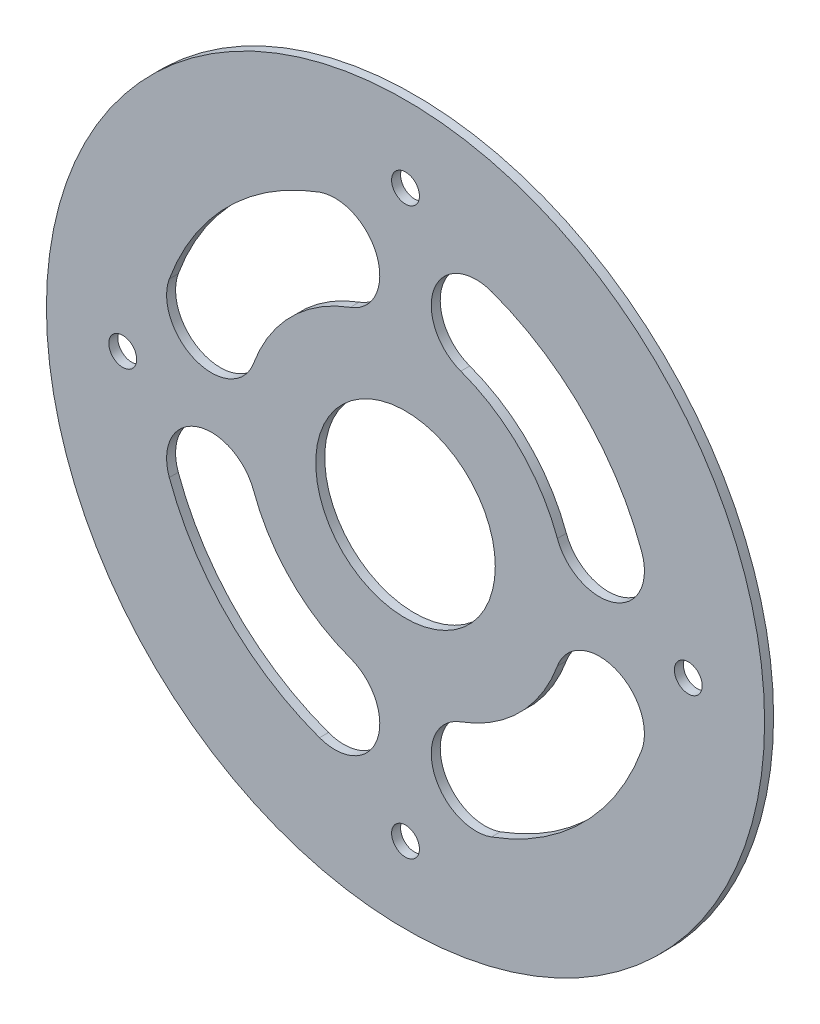
ISO-10303-21;
HEADER;
FILE_DESCRIPTION(('STEP AP214'),'2;1');
FILE_NAME('part.step','',(''),(''),'','','');
FILE_SCHEMA(('AUTOMOTIVE_DESIGN { 1 0 10303 214 1 1 1 1 }'));
ENDSEC;
DATA;
#1=APPLICATION_CONTEXT('core data for automotive mechanical design processes');
#2=APPLICATION_PROTOCOL_DEFINITION('international standard','automotive_design',2000,#1);
#3=PRODUCT_CONTEXT('',#1,'mechanical');
#4=PRODUCT('Part','Part','',(#3));
#5=PRODUCT_RELATED_PRODUCT_CATEGORY('part','',(#4));
#6=PRODUCT_DEFINITION_FORMATION('','',#4);
#7=PRODUCT_DEFINITION_CONTEXT('part definition',#1,'design');
#8=PRODUCT_DEFINITION('design','',#6,#7);
#9=PRODUCT_DEFINITION_SHAPE('','',#8);
#10=(LENGTH_UNIT() NAMED_UNIT(*) SI_UNIT(.MILLI.,.METRE.));
#11=(NAMED_UNIT(*) PLANE_ANGLE_UNIT() SI_UNIT($,.RADIAN.));
#12=(NAMED_UNIT(*) SI_UNIT($,.STERADIAN.) SOLID_ANGLE_UNIT());
#13=UNCERTAINTY_MEASURE_WITH_UNIT(LENGTH_MEASURE(1.E-05),#10,'distance_accuracy_value','');
#14=(GEOMETRIC_REPRESENTATION_CONTEXT(3) GLOBAL_UNCERTAINTY_ASSIGNED_CONTEXT((#13)) GLOBAL_UNIT_ASSIGNED_CONTEXT((#10,
#11,#12)) REPRESENTATION_CONTEXT('',''));
#15=CARTESIAN_POINT('',(0.,0.,0.));
#16=DIRECTION('',(0.,0.,1.));
#17=DIRECTION('',(1.,0.,0.));
#18=AXIS2_PLACEMENT_3D('',#15,#16,#17);
#19=CARTESIAN_POINT('',(0.,0.,1.));
#20=DIRECTION('',(0.,0.,-1.));
#21=DIRECTION('',(-1.,0.,0.));
#22=AXIS2_PLACEMENT_3D('',#19,#20,#21);
#23=CYLINDRICAL_SURFACE('',#22,40.);
#24=CARTESIAN_POINT('',(0.,0.,1.));
#25=DIRECTION('',(0.,0.,1.));
#26=DIRECTION('',(1.,0.,0.));
#27=AXIS2_PLACEMENT_3D('',#24,#25,#26);
#28=CIRCLE('',#27,40.);
#29=CARTESIAN_POINT('',(40.,0.,1.));
#30=VERTEX_POINT('',#29);
#31=EDGE_CURVE('E11',#30,#30,#28,.T.);
#32=ORIENTED_EDGE('',*,*,#31,.F.);
#33=EDGE_LOOP('',(#32));
#34=FACE_BOUND('',#33,.T.);
#35=CARTESIAN_POINT('',(0.,0.,0.));
#36=DIRECTION('',(0.,0.,1.));
#37=DIRECTION('',(1.,0.,0.));
#38=AXIS2_PLACEMENT_3D('',#35,#36,#37);
#39=CIRCLE('',#38,40.);
#40=CARTESIAN_POINT('',(40.,0.,0.));
#41=VERTEX_POINT('',#40);
#42=EDGE_CURVE('E39',#41,#41,#39,.T.);
#43=ORIENTED_EDGE('',*,*,#42,.T.);
#44=EDGE_LOOP('',(#43));
#45=FACE_BOUND('',#44,.T.);
#46=ADVANCED_FACE('F36',(#34,#45),#23,.T.);
#47=CARTESIAN_POINT('',(0.,0.,1.));
#48=DIRECTION('',(0.,0.,1.));
#49=DIRECTION('',(1.,0.,0.));
#50=AXIS2_PLACEMENT_3D('',#47,#48,#49);
#51=PLANE('',#50);
#52=CARTESIAN_POINT('',(21.6129302780759,7.86646329649048,1.));
#53=DIRECTION('',(0.,0.,1.));
#54=DIRECTION('',(0.,1.,0.));
#55=AXIS2_PLACEMENT_3D('',#52,#53,#54);
#56=CIRCLE('',#55,5.);
#57=CARTESIAN_POINT('',(16.9144671741463,6.15636257986211,1.));
#58=VERTEX_POINT('',#57);
#59=CARTESIAN_POINT('',(26.3113933820054,9.57656401311882,1.));
#60=VERTEX_POINT('',#59);
#61=EDGE_CURVE('E50',#58,#60,#56,.T.);
#62=ORIENTED_EDGE('',*,*,#61,.F.);
#63=CARTESIAN_POINT('',(0.,0.,1.));
#64=DIRECTION('',(0.,0.,-1.));
#65=DIRECTION('',(0.,1.,0.));
#66=AXIS2_PLACEMENT_3D('',#63,#64,#65);
#67=CIRCLE('',#66,18.);
#68=CARTESIAN_POINT('',(6.15636257986199,16.9144671741464,1.));
#69=VERTEX_POINT('',#68);
#70=EDGE_CURVE('E169',#69,#58,#67,.T.);
#71=ORIENTED_EDGE('',*,*,#70,.F.);
#72=CARTESIAN_POINT('',(7.86646329649031,21.6129302780759,1.));
#73=DIRECTION('',(0.,0.,1.));
#74=DIRECTION('',(0.,1.,0.));
#75=AXIS2_PLACEMENT_3D('',#72,#73,#74);
#76=CIRCLE('',#75,5.);
#77=CARTESIAN_POINT('',(9.57656401311865,26.3113933820055,1.));
#78=VERTEX_POINT('',#77);
#79=EDGE_CURVE('E172',#78,#69,#76,.T.);
#80=ORIENTED_EDGE('',*,*,#79,.F.);
#81=CARTESIAN_POINT('',(0.,0.,1.));
#82=DIRECTION('',(0.,0.,1.));
#83=DIRECTION('',(0.,1.,0.));
#84=AXIS2_PLACEMENT_3D('',#81,#82,#83);
#85=CIRCLE('',#84,28.);
#86=EDGE_CURVE('E178',#60,#78,#85,.T.);
#87=ORIENTED_EDGE('',*,*,#86,.F.);
#88=EDGE_LOOP('',(#62,#71,#80,#87));
#89=FACE_BOUND('',#88,.T.);
#90=CARTESIAN_POINT('',(-7.8664632964904,21.6129302780759,1.));
#91=DIRECTION('',(0.,0.,1.));
#92=DIRECTION('',(-1.,0.,0.));
#93=AXIS2_PLACEMENT_3D('',#90,#91,#92);
#94=CIRCLE('',#93,5.);
#95=CARTESIAN_POINT('',(-6.15636257986205,16.9144671741463,1.));
#96=VERTEX_POINT('',#95);
#97=CARTESIAN_POINT('',(-9.57656401311873,26.3113933820054,1.));
#98=VERTEX_POINT('',#97);
#99=EDGE_CURVE('E58',#96,#98,#94,.T.);
#100=ORIENTED_EDGE('',*,*,#99,.F.);
#101=CARTESIAN_POINT('',(0.,0.,1.));
#102=DIRECTION('',(0.,0.,-1.));
#103=DIRECTION('',(-1.,0.,0.));
#104=AXIS2_PLACEMENT_3D('',#101,#102,#103);
#105=CIRCLE('',#104,18.);
#106=CARTESIAN_POINT('',(-16.9144671741463,6.15636257986205,1.));
#107=VERTEX_POINT('',#106);
#108=EDGE_CURVE('E193',#107,#96,#105,.T.);
#109=ORIENTED_EDGE('',*,*,#108,.F.);
#110=CARTESIAN_POINT('',(-21.6129302780759,7.86646329649039,1.));
#111=DIRECTION('',(0.,0.,1.));
#112=DIRECTION('',(-1.,0.,0.));
#113=AXIS2_PLACEMENT_3D('',#110,#111,#112);
#114=CIRCLE('',#113,5.);
#115=CARTESIAN_POINT('',(-26.3113933820054,9.57656401311874,1.));
#116=VERTEX_POINT('',#115);
#117=EDGE_CURVE('E208',#116,#107,#114,.T.);
#118=ORIENTED_EDGE('',*,*,#117,.F.);
#119=CARTESIAN_POINT('',(0.,0.,1.));
#120=DIRECTION('',(0.,0.,1.));
#121=DIRECTION('',(-1.,0.,0.));
#122=AXIS2_PLACEMENT_3D('',#119,#120,#121);
#123=CIRCLE('',#122,28.);
#124=EDGE_CURVE('E204',#98,#116,#123,.T.);
#125=ORIENTED_EDGE('',*,*,#124,.F.);
#126=EDGE_LOOP('',(#100,#109,#118,#125));
#127=FACE_BOUND('',#126,.T.);
#128=CARTESIAN_POINT('',(-21.6129302780758,-7.86646329649063,1.));
#129=DIRECTION('',(0.,0.,1.));
#130=DIRECTION('',(0.,-1.,0.));
#131=AXIS2_PLACEMENT_3D('',#128,#129,#130);
#132=CIRCLE('',#131,5.);
#133=CARTESIAN_POINT('',(-16.9144671741463,-6.15636257986223,1.));
#134=VERTEX_POINT('',#133);
#135=CARTESIAN_POINT('',(-26.3113933820053,-9.57656401311901,1.));
#136=VERTEX_POINT('',#135);
#137=EDGE_CURVE('E233',#134,#136,#132,.T.);
#138=ORIENTED_EDGE('',*,*,#137,.F.);
#139=CARTESIAN_POINT('',(0.,0.,1.));
#140=DIRECTION('',(0.,0.,-1.));
#141=DIRECTION('',(0.,-1.,0.));
#142=AXIS2_PLACEMENT_3D('',#139,#140,#141);
#143=CIRCLE('',#142,18.);
#144=CARTESIAN_POINT('',(-6.15636257986187,-16.9144671741464,1.));
#145=VERTEX_POINT('',#144);
#146=EDGE_CURVE('E223',#145,#134,#143,.T.);
#147=ORIENTED_EDGE('',*,*,#146,.F.);
#148=CARTESIAN_POINT('',(-7.86646329649016,-21.612930278076,1.));
#149=DIRECTION('',(0.,0.,1.));
#150=DIRECTION('',(0.,-1.,0.));
#151=AXIS2_PLACEMENT_3D('',#148,#149,#150);
#152=CIRCLE('',#151,5.);
#153=CARTESIAN_POINT('',(-9.57656401311847,-26.3113933820055,1.));
#154=VERTEX_POINT('',#153);
#155=EDGE_CURVE('E238',#154,#145,#152,.T.);
#156=ORIENTED_EDGE('',*,*,#155,.F.);
#157=CARTESIAN_POINT('',(0.,0.,1.));
#158=DIRECTION('',(0.,0.,1.));
#159=DIRECTION('',(0.,-1.,0.));
#160=AXIS2_PLACEMENT_3D('',#157,#158,#159);
#161=CIRCLE('',#160,28.);
#162=EDGE_CURVE('E235',#136,#154,#161,.T.);
#163=ORIENTED_EDGE('',*,*,#162,.F.);
#164=EDGE_LOOP('',(#138,#147,#156,#163));
#165=FACE_BOUND('',#164,.T.);
#166=CARTESIAN_POINT('',(7.8664632964904,-21.6129302780759,1.));
#167=DIRECTION('',(0.,0.,1.));
#168=DIRECTION('',(1.,0.,0.));
#169=AXIS2_PLACEMENT_3D('',#166,#167,#168);
#170=CIRCLE('',#169,5.);
#171=CARTESIAN_POINT('',(6.15636257986205,-16.9144671741463,1.));
#172=VERTEX_POINT('',#171);
#173=CARTESIAN_POINT('',(9.57656401311873,-26.3113933820054,1.));
#174=VERTEX_POINT('',#173);
#175=EDGE_CURVE('E185',#172,#174,#170,.T.);
#176=ORIENTED_EDGE('',*,*,#175,.F.);
#177=CARTESIAN_POINT('',(0.,0.,1.));
#178=DIRECTION('',(0.,0.,-1.));
#179=DIRECTION('',(1.,0.,0.));
#180=AXIS2_PLACEMENT_3D('',#177,#178,#179);
#181=CIRCLE('',#180,18.);
#182=CARTESIAN_POINT('',(16.9144671741463,-6.15636257986205,1.));
#183=VERTEX_POINT('',#182);
#184=EDGE_CURVE('E254',#183,#172,#181,.T.);
#185=ORIENTED_EDGE('',*,*,#184,.F.);
#186=CARTESIAN_POINT('',(21.6129302780759,-7.86646329649039,1.));
#187=DIRECTION('',(0.,0.,1.));
#188=DIRECTION('',(1.,0.,0.));
#189=AXIS2_PLACEMENT_3D('',#186,#187,#188);
#190=CIRCLE('',#189,5.);
#191=CARTESIAN_POINT('',(26.3113933820054,-9.57656401311874,1.));
#192=VERTEX_POINT('',#191);
#193=EDGE_CURVE('E268',#192,#183,#190,.T.);
#194=ORIENTED_EDGE('',*,*,#193,.F.);
#195=CARTESIAN_POINT('',(0.,0.,1.));
#196=DIRECTION('',(0.,0.,1.));
#197=DIRECTION('',(1.,0.,0.));
#198=AXIS2_PLACEMENT_3D('',#195,#196,#197);
#199=CIRCLE('',#198,28.);
#200=EDGE_CURVE('E265',#174,#192,#199,.T.);
#201=ORIENTED_EDGE('',*,*,#200,.F.);
#202=EDGE_LOOP('',(#176,#185,#194,#201));
#203=FACE_BOUND('',#202,.T.);
#204=CARTESIAN_POINT('',(0.,0.,1.));
#205=DIRECTION('',(0.,0.,1.));
#206=DIRECTION('',(1.,0.,0.));
#207=AXIS2_PLACEMENT_3D('',#204,#205,#206);
#208=CIRCLE('',#207,10.);
#209=CARTESIAN_POINT('',(10.,0.,1.));
#210=VERTEX_POINT('',#209);
#211=EDGE_CURVE('E275',#210,#210,#208,.T.);
#212=ORIENTED_EDGE('',*,*,#211,.F.);
#213=EDGE_LOOP('',(#212));
#214=FACE_BOUND('',#213,.T.);
#215=CARTESIAN_POINT('',(0.,31.5,1.));
#216=DIRECTION('',(0.,0.,1.));
#217=DIRECTION('',(1.,0.,0.));
#218=AXIS2_PLACEMENT_3D('',#215,#216,#217);
#219=CIRCLE('',#218,1.55);
#220=CARTESIAN_POINT('',(1.55,31.5,1.));
#221=VERTEX_POINT('',#220);
#222=EDGE_CURVE('E291',#221,#221,#219,.T.);
#223=ORIENTED_EDGE('',*,*,#222,.F.);
#224=EDGE_LOOP('',(#223));
#225=FACE_BOUND('',#224,.T.);
#226=CARTESIAN_POINT('',(-31.5,0.,1.));
#227=DIRECTION('',(0.,0.,1.));
#228=DIRECTION('',(1.,0.,0.));
#229=AXIS2_PLACEMENT_3D('',#226,#227,#228);
#230=CIRCLE('',#229,1.55);
#231=CARTESIAN_POINT('',(-29.95,0.,1.));
#232=VERTEX_POINT('',#231);
#233=EDGE_CURVE('E297',#232,#232,#230,.T.);
#234=ORIENTED_EDGE('',*,*,#233,.F.);
#235=EDGE_LOOP('',(#234));
#236=FACE_BOUND('',#235,.T.);
#237=CARTESIAN_POINT('',(0.,-31.5,1.));
#238=DIRECTION('',(0.,0.,1.));
#239=DIRECTION('',(1.,0.,0.));
#240=AXIS2_PLACEMENT_3D('',#237,#238,#239);
#241=CIRCLE('',#240,1.55);
#242=CARTESIAN_POINT('',(1.55,-31.5,1.));
#243=VERTEX_POINT('',#242);
#244=EDGE_CURVE('E303',#243,#243,#241,.T.);
#245=ORIENTED_EDGE('',*,*,#244,.F.);
#246=EDGE_LOOP('',(#245));
#247=FACE_BOUND('',#246,.T.);
#248=CARTESIAN_POINT('',(31.5,0.,1.));
#249=DIRECTION('',(0.,0.,1.));
#250=DIRECTION('',(1.,0.,0.));
#251=AXIS2_PLACEMENT_3D('',#248,#249,#250);
#252=CIRCLE('',#251,1.55);
#253=CARTESIAN_POINT('',(33.05,0.,1.));
#254=VERTEX_POINT('',#253);
#255=EDGE_CURVE('E285',#254,#254,#252,.T.);
#256=ORIENTED_EDGE('',*,*,#255,.F.);
#257=EDGE_LOOP('',(#256));
#258=FACE_BOUND('',#257,.T.);
#259=ORIENTED_EDGE('',*,*,#31,.T.);
#260=EDGE_LOOP('',(#259));
#261=FACE_BOUND('',#260,.T.);
#262=ADVANCED_FACE('F314',(#89,#127,#165,#203,#214,#225,#236,#247,#258,#261),#51,.T.);
#263=CARTESIAN_POINT('',(0.,0.,0.));
#264=DIRECTION('',(0.,0.,1.));
#265=DIRECTION('',(1.,0.,0.));
#266=AXIS2_PLACEMENT_3D('',#263,#264,#265);
#267=PLANE('',#266);
#268=CARTESIAN_POINT('',(0.,0.,0.));
#269=DIRECTION('',(0.,0.,-1.));
#270=DIRECTION('',(0.,1.,0.));
#271=AXIS2_PLACEMENT_3D('',#268,#269,#270);
#272=CIRCLE('',#271,18.);
#273=CARTESIAN_POINT('',(6.15636257986199,16.9144671741464,0.));
#274=VERTEX_POINT('',#273);
#275=CARTESIAN_POINT('',(16.9144671741463,6.15636257986211,0.));
#276=VERTEX_POINT('',#275);
#277=EDGE_CURVE('E156',#274,#276,#272,.T.);
#278=ORIENTED_EDGE('',*,*,#277,.T.);
#279=CARTESIAN_POINT('',(21.6129302780759,7.86646329649048,0.));
#280=DIRECTION('',(0.,0.,1.));
#281=DIRECTION('',(0.,1.,0.));
#282=AXIS2_PLACEMENT_3D('',#279,#280,#281);
#283=CIRCLE('',#282,5.);
#284=CARTESIAN_POINT('',(26.3113933820054,9.57656401311882,0.));
#285=VERTEX_POINT('',#284);
#286=EDGE_CURVE('E150',#276,#285,#283,.T.);
#287=ORIENTED_EDGE('',*,*,#286,.T.);
#288=CARTESIAN_POINT('',(0.,0.,0.));
#289=DIRECTION('',(0.,0.,1.));
#290=DIRECTION('',(0.,1.,0.));
#291=AXIS2_PLACEMENT_3D('',#288,#289,#290);
#292=CIRCLE('',#291,28.);
#293=CARTESIAN_POINT('',(9.57656401311865,26.3113933820055,0.));
#294=VERTEX_POINT('',#293);
#295=EDGE_CURVE('E160',#285,#294,#292,.T.);
#296=ORIENTED_EDGE('',*,*,#295,.T.);
#297=CARTESIAN_POINT('',(7.86646329649031,21.6129302780759,0.));
#298=DIRECTION('',(0.,0.,1.));
#299=DIRECTION('',(0.,1.,0.));
#300=AXIS2_PLACEMENT_3D('',#297,#298,#299);
#301=CIRCLE('',#300,5.);
#302=EDGE_CURVE('E164',#294,#274,#301,.T.);
#303=ORIENTED_EDGE('',*,*,#302,.T.);
#304=EDGE_LOOP('',(#278,#287,#296,#303));
#305=FACE_BOUND('',#304,.T.);
#306=CARTESIAN_POINT('',(0.,0.,0.));
#307=DIRECTION('',(0.,0.,-1.));
#308=DIRECTION('',(-1.,0.,0.));
#309=AXIS2_PLACEMENT_3D('',#306,#307,#308);
#310=CIRCLE('',#309,18.);
#311=CARTESIAN_POINT('',(-16.9144671741463,6.15636257986205,0.));
#312=VERTEX_POINT('',#311);
#313=CARTESIAN_POINT('',(-6.15636257986205,16.9144671741463,0.));
#314=VERTEX_POINT('',#313);
#315=EDGE_CURVE('E199',#312,#314,#310,.T.);
#316=ORIENTED_EDGE('',*,*,#315,.T.);
#317=CARTESIAN_POINT('',(-7.8664632964904,21.6129302780759,0.));
#318=DIRECTION('',(0.,0.,1.));
#319=DIRECTION('',(-1.,0.,0.));
#320=AXIS2_PLACEMENT_3D('',#317,#318,#319);
#321=CIRCLE('',#320,5.);
#322=CARTESIAN_POINT('',(-9.57656401311873,26.3113933820054,0.));
#323=VERTEX_POINT('',#322);
#324=EDGE_CURVE('E189',#314,#323,#321,.T.);
#325=ORIENTED_EDGE('',*,*,#324,.T.);
#326=CARTESIAN_POINT('',(0.,0.,0.));
#327=DIRECTION('',(0.,0.,1.));
#328=DIRECTION('',(-1.,0.,0.));
#329=AXIS2_PLACEMENT_3D('',#326,#327,#328);
#330=CIRCLE('',#329,28.);
#331=CARTESIAN_POINT('',(-26.3113933820054,9.57656401311874,0.));
#332=VERTEX_POINT('',#331);
#333=EDGE_CURVE('E192',#323,#332,#330,.T.);
#334=ORIENTED_EDGE('',*,*,#333,.T.);
#335=CARTESIAN_POINT('',(-21.6129302780759,7.86646329649039,0.));
#336=DIRECTION('',(0.,0.,1.));
#337=DIRECTION('',(-1.,0.,0.));
#338=AXIS2_PLACEMENT_3D('',#335,#336,#337);
#339=CIRCLE('',#338,5.);
#340=EDGE_CURVE('E196',#332,#312,#339,.T.);
#341=ORIENTED_EDGE('',*,*,#340,.T.);
#342=EDGE_LOOP('',(#316,#325,#334,#341));
#343=FACE_BOUND('',#342,.T.);
#344=CARTESIAN_POINT('',(0.,0.,0.));
#345=DIRECTION('',(0.,0.,-1.));
#346=DIRECTION('',(0.,-1.,0.));
#347=AXIS2_PLACEMENT_3D('',#344,#345,#346);
#348=CIRCLE('',#347,18.);
#349=CARTESIAN_POINT('',(-6.15636257986187,-16.9144671741464,0.));
#350=VERTEX_POINT('',#349);
#351=CARTESIAN_POINT('',(-16.9144671741463,-6.15636257986223,0.));
#352=VERTEX_POINT('',#351);
#353=EDGE_CURVE('E229',#350,#352,#348,.T.);
#354=ORIENTED_EDGE('',*,*,#353,.T.);
#355=CARTESIAN_POINT('',(-21.6129302780758,-7.86646329649063,0.));
#356=DIRECTION('',(0.,0.,1.));
#357=DIRECTION('',(0.,-1.,0.));
#358=AXIS2_PLACEMENT_3D('',#355,#356,#357);
#359=CIRCLE('',#358,5.);
#360=CARTESIAN_POINT('',(-26.3113933820053,-9.57656401311901,0.));
#361=VERTEX_POINT('',#360);
#362=EDGE_CURVE('E219',#352,#361,#359,.T.);
#363=ORIENTED_EDGE('',*,*,#362,.T.);
#364=CARTESIAN_POINT('',(0.,0.,0.));
#365=DIRECTION('',(0.,0.,1.));
#366=DIRECTION('',(0.,-1.,0.));
#367=AXIS2_PLACEMENT_3D('',#364,#365,#366);
#368=CIRCLE('',#367,28.);
#369=CARTESIAN_POINT('',(-9.57656401311847,-26.3113933820055,0.));
#370=VERTEX_POINT('',#369);
#371=EDGE_CURVE('E222',#361,#370,#368,.T.);
#372=ORIENTED_EDGE('',*,*,#371,.T.);
#373=CARTESIAN_POINT('',(-7.86646329649016,-21.612930278076,0.));
#374=DIRECTION('',(0.,0.,1.));
#375=DIRECTION('',(0.,-1.,0.));
#376=AXIS2_PLACEMENT_3D('',#373,#374,#375);
#377=CIRCLE('',#376,5.);
#378=EDGE_CURVE('E226',#370,#350,#377,.T.);
#379=ORIENTED_EDGE('',*,*,#378,.T.);
#380=EDGE_LOOP('',(#354,#363,#372,#379));
#381=FACE_BOUND('',#380,.T.);
#382=CARTESIAN_POINT('',(0.,0.,0.));
#383=DIRECTION('',(0.,0.,-1.));
#384=DIRECTION('',(1.,0.,0.));
#385=AXIS2_PLACEMENT_3D('',#382,#383,#384);
#386=CIRCLE('',#385,18.);
#387=CARTESIAN_POINT('',(16.9144671741463,-6.15636257986205,0.));
#388=VERTEX_POINT('',#387);
#389=CARTESIAN_POINT('',(6.15636257986205,-16.9144671741463,0.));
#390=VERTEX_POINT('',#389);
#391=EDGE_CURVE('E260',#388,#390,#386,.T.);
#392=ORIENTED_EDGE('',*,*,#391,.T.);
#393=CARTESIAN_POINT('',(7.8664632964904,-21.6129302780759,0.));
#394=DIRECTION('',(0.,0.,1.));
#395=DIRECTION('',(1.,0.,0.));
#396=AXIS2_PLACEMENT_3D('',#393,#394,#395);
#397=CIRCLE('',#396,5.);
#398=CARTESIAN_POINT('',(9.57656401311873,-26.3113933820054,0.));
#399=VERTEX_POINT('',#398);
#400=EDGE_CURVE('E250',#390,#399,#397,.T.);
#401=ORIENTED_EDGE('',*,*,#400,.T.);
#402=CARTESIAN_POINT('',(0.,0.,0.));
#403=DIRECTION('',(0.,0.,1.));
#404=DIRECTION('',(1.,0.,0.));
#405=AXIS2_PLACEMENT_3D('',#402,#403,#404);
#406=CIRCLE('',#405,28.);
#407=CARTESIAN_POINT('',(26.3113933820054,-9.57656401311874,0.));
#408=VERTEX_POINT('',#407);
#409=EDGE_CURVE('E253',#399,#408,#406,.T.);
#410=ORIENTED_EDGE('',*,*,#409,.T.);
#411=CARTESIAN_POINT('',(21.6129302780759,-7.86646329649039,0.));
#412=DIRECTION('',(0.,0.,1.));
#413=DIRECTION('',(1.,0.,0.));
#414=AXIS2_PLACEMENT_3D('',#411,#412,#413);
#415=CIRCLE('',#414,5.);
#416=EDGE_CURVE('E257',#408,#388,#415,.T.);
#417=ORIENTED_EDGE('',*,*,#416,.T.);
#418=EDGE_LOOP('',(#392,#401,#410,#417));
#419=FACE_BOUND('',#418,.T.);
#420=CARTESIAN_POINT('',(0.,0.,0.));
#421=DIRECTION('',(0.,0.,1.));
#422=DIRECTION('',(1.,0.,0.));
#423=AXIS2_PLACEMENT_3D('',#420,#421,#422);
#424=CIRCLE('',#423,10.);
#425=CARTESIAN_POINT('',(10.,0.,0.));
#426=VERTEX_POINT('',#425);
#427=EDGE_CURVE('E282',#426,#426,#424,.T.);
#428=ORIENTED_EDGE('',*,*,#427,.T.);
#429=EDGE_LOOP('',(#428));
#430=FACE_BOUND('',#429,.T.);
#431=CARTESIAN_POINT('',(0.,31.5,0.));
#432=DIRECTION('',(0.,0.,1.));
#433=DIRECTION('',(1.,0.,0.));
#434=AXIS2_PLACEMENT_3D('',#431,#432,#433);
#435=CIRCLE('',#434,1.55);
#436=CARTESIAN_POINT('',(1.55,31.5,0.));
#437=VERTEX_POINT('',#436);
#438=EDGE_CURVE('E288',#437,#437,#435,.T.);
#439=ORIENTED_EDGE('',*,*,#438,.T.);
#440=EDGE_LOOP('',(#439));
#441=FACE_BOUND('',#440,.T.);
#442=CARTESIAN_POINT('',(-31.5,0.,0.));
#443=DIRECTION('',(0.,0.,1.));
#444=DIRECTION('',(1.,0.,0.));
#445=AXIS2_PLACEMENT_3D('',#442,#443,#444);
#446=CIRCLE('',#445,1.55);
#447=CARTESIAN_POINT('',(-29.95,0.,0.));
#448=VERTEX_POINT('',#447);
#449=EDGE_CURVE('E294',#448,#448,#446,.T.);
#450=ORIENTED_EDGE('',*,*,#449,.T.);
#451=EDGE_LOOP('',(#450));
#452=FACE_BOUND('',#451,.T.);
#453=CARTESIAN_POINT('',(0.,-31.5,0.));
#454=DIRECTION('',(0.,0.,1.));
#455=DIRECTION('',(1.,0.,0.));
#456=AXIS2_PLACEMENT_3D('',#453,#454,#455);
#457=CIRCLE('',#456,1.55);
#458=CARTESIAN_POINT('',(1.55,-31.5,0.));
#459=VERTEX_POINT('',#458);
#460=EDGE_CURVE('E300',#459,#459,#457,.T.);
#461=ORIENTED_EDGE('',*,*,#460,.T.);
#462=EDGE_LOOP('',(#461));
#463=FACE_BOUND('',#462,.T.);
#464=CARTESIAN_POINT('',(31.5,0.,0.));
#465=DIRECTION('',(0.,0.,1.));
#466=DIRECTION('',(1.,0.,0.));
#467=AXIS2_PLACEMENT_3D('',#464,#465,#466);
#468=CIRCLE('',#467,1.55);
#469=CARTESIAN_POINT('',(33.05,0.,0.));
#470=VERTEX_POINT('',#469);
#471=EDGE_CURVE('E306',#470,#470,#468,.T.);
#472=ORIENTED_EDGE('',*,*,#471,.T.);
#473=EDGE_LOOP('',(#472));
#474=FACE_BOUND('',#473,.T.);
#475=ORIENTED_EDGE('',*,*,#42,.F.);
#476=EDGE_LOOP('',(#475));
#477=FACE_BOUND('',#476,.T.);
#478=ADVANCED_FACE('F166',(#305,#343,#381,#419,#430,#441,#452,#463,#474,#477),#267,.F.);
#479=CARTESIAN_POINT('',(31.5,0.,0.));
#480=DIRECTION('',(0.,0.,1.));
#481=DIRECTION('',(1.,0.,0.));
#482=AXIS2_PLACEMENT_3D('',#479,#480,#481);
#483=CYLINDRICAL_SURFACE('',#482,1.55);
#484=ORIENTED_EDGE('',*,*,#471,.F.);
#485=EDGE_LOOP('',(#484));
#486=FACE_BOUND('',#485,.T.);
#487=ORIENTED_EDGE('',*,*,#255,.T.);
#488=EDGE_LOOP('',(#487));
#489=FACE_BOUND('',#488,.T.);
#490=ADVANCED_FACE('F312',(#486,#489),#483,.F.);
#491=CARTESIAN_POINT('',(0.,-31.5,0.));
#492=DIRECTION('',(0.,0.,1.));
#493=DIRECTION('',(1.,0.,0.));
#494=AXIS2_PLACEMENT_3D('',#491,#492,#493);
#495=CYLINDRICAL_SURFACE('',#494,1.55);
#496=ORIENTED_EDGE('',*,*,#460,.F.);
#497=EDGE_LOOP('',(#496));
#498=FACE_BOUND('',#497,.T.);
#499=ORIENTED_EDGE('',*,*,#244,.T.);
#500=EDGE_LOOP('',(#499));
#501=FACE_BOUND('',#500,.T.);
#502=ADVANCED_FACE('F330',(#498,#501),#495,.F.);
#503=CARTESIAN_POINT('',(-31.5,0.,0.));
#504=DIRECTION('',(0.,0.,1.));
#505=DIRECTION('',(1.,0.,0.));
#506=AXIS2_PLACEMENT_3D('',#503,#504,#505);
#507=CYLINDRICAL_SURFACE('',#506,1.55);
#508=ORIENTED_EDGE('',*,*,#449,.F.);
#509=EDGE_LOOP('',(#508));
#510=FACE_BOUND('',#509,.T.);
#511=ORIENTED_EDGE('',*,*,#233,.T.);
#512=EDGE_LOOP('',(#511));
#513=FACE_BOUND('',#512,.T.);
#514=ADVANCED_FACE('F336',(#510,#513),#507,.F.);
#515=CARTESIAN_POINT('',(0.,31.5,0.));
#516=DIRECTION('',(0.,0.,1.));
#517=DIRECTION('',(1.,0.,0.));
#518=AXIS2_PLACEMENT_3D('',#515,#516,#517);
#519=CYLINDRICAL_SURFACE('',#518,1.55);
#520=ORIENTED_EDGE('',*,*,#438,.F.);
#521=EDGE_LOOP('',(#520));
#522=FACE_BOUND('',#521,.T.);
#523=ORIENTED_EDGE('',*,*,#222,.T.);
#524=EDGE_LOOP('',(#523));
#525=FACE_BOUND('',#524,.T.);
#526=ADVANCED_FACE('F340',(#522,#525),#519,.F.);
#527=CARTESIAN_POINT('',(0.,0.,0.));
#528=DIRECTION('',(0.,0.,1.));
#529=DIRECTION('',(1.,0.,0.));
#530=AXIS2_PLACEMENT_3D('',#527,#528,#529);
#531=CYLINDRICAL_SURFACE('',#530,10.);
#532=ORIENTED_EDGE('',*,*,#427,.F.);
#533=EDGE_LOOP('',(#532));
#534=FACE_BOUND('',#533,.T.);
#535=ORIENTED_EDGE('',*,*,#211,.T.);
#536=EDGE_LOOP('',(#535));
#537=FACE_BOUND('',#536,.T.);
#538=ADVANCED_FACE('F344',(#534,#537),#531,.F.);
#539=CARTESIAN_POINT('',(7.8664632964904,-21.6129302780759,0.));
#540=DIRECTION('',(0.,0.,1.));
#541=DIRECTION('',(1.,0.,0.));
#542=AXIS2_PLACEMENT_3D('',#539,#540,#541);
#543=CYLINDRICAL_SURFACE('',#542,5.);
#544=ORIENTED_EDGE('',*,*,#175,.T.);
#545=DIRECTION('',(0.,0.,1.));
#546=VECTOR('',#545,1.);
#547=CARTESIAN_POINT('',(9.57656401311873,-26.3113933820054,0.));
#548=LINE('',#547,#546);
#549=EDGE_CURVE('E263',#399,#174,#548,.T.);
#550=ORIENTED_EDGE('',*,*,#549,.F.);
#551=ORIENTED_EDGE('',*,*,#400,.F.);
#552=DIRECTION('',(0.,0.,1.));
#553=VECTOR('',#552,1.);
#554=CARTESIAN_POINT('',(6.15636257986205,-16.9144671741463,0.));
#555=LINE('',#554,#553);
#556=EDGE_CURVE('E273',#390,#172,#555,.T.);
#557=ORIENTED_EDGE('',*,*,#556,.T.);
#558=EDGE_LOOP('',(#544,#550,#551,#557));
#559=FACE_BOUND('',#558,.T.);
#560=ADVANCED_FACE('F348',(#559),#543,.F.);
#561=CARTESIAN_POINT('',(0.,0.,0.));
#562=DIRECTION('',(0.,0.,1.));
#563=DIRECTION('',(1.,0.,0.));
#564=AXIS2_PLACEMENT_3D('',#561,#562,#563);
#565=CYLINDRICAL_SURFACE('',#564,18.);
#566=ORIENTED_EDGE('',*,*,#184,.T.);
#567=ORIENTED_EDGE('',*,*,#556,.F.);
#568=ORIENTED_EDGE('',*,*,#391,.F.);
#569=DIRECTION('',(0.,0.,1.));
#570=VECTOR('',#569,1.);
#571=CARTESIAN_POINT('',(16.9144671741463,-6.15636257986205,0.));
#572=LINE('',#571,#570);
#573=EDGE_CURVE('E276',#388,#183,#572,.T.);
#574=ORIENTED_EDGE('',*,*,#573,.T.);
#575=EDGE_LOOP('',(#566,#567,#568,#574));
#576=FACE_BOUND('',#575,.T.);
#577=ADVANCED_FACE('F352',(#576),#565,.T.);
#578=CARTESIAN_POINT('',(21.6129302780759,-7.86646329649039,0.));
#579=DIRECTION('',(0.,0.,1.));
#580=DIRECTION('',(1.,0.,0.));
#581=AXIS2_PLACEMENT_3D('',#578,#579,#580);
#582=CYLINDRICAL_SURFACE('',#581,5.);
#583=ORIENTED_EDGE('',*,*,#193,.T.);
#584=ORIENTED_EDGE('',*,*,#573,.F.);
#585=ORIENTED_EDGE('',*,*,#416,.F.);
#586=DIRECTION('',(0.,0.,1.));
#587=VECTOR('',#586,1.);
#588=CARTESIAN_POINT('',(26.3113933820054,-9.57656401311874,0.));
#589=LINE('',#588,#587);
#590=EDGE_CURVE('E278',#408,#192,#589,.T.);
#591=ORIENTED_EDGE('',*,*,#590,.T.);
#592=EDGE_LOOP('',(#583,#584,#585,#591));
#593=FACE_BOUND('',#592,.T.);
#594=ADVANCED_FACE('F358',(#593),#582,.F.);
#595=CARTESIAN_POINT('',(0.,0.,0.));
#596=DIRECTION('',(0.,0.,1.));
#597=DIRECTION('',(1.,0.,0.));
#598=AXIS2_PLACEMENT_3D('',#595,#596,#597);
#599=CYLINDRICAL_SURFACE('',#598,28.);
#600=ORIENTED_EDGE('',*,*,#200,.T.);
#601=ORIENTED_EDGE('',*,*,#590,.F.);
#602=ORIENTED_EDGE('',*,*,#409,.F.);
#603=ORIENTED_EDGE('',*,*,#549,.T.);
#604=EDGE_LOOP('',(#600,#601,#602,#603));
#605=FACE_BOUND('',#604,.T.);
#606=ADVANCED_FACE('F354',(#605),#599,.F.);
#607=CARTESIAN_POINT('',(-21.6129302780758,-7.86646329649063,0.));
#608=DIRECTION('',(0.,0.,1.));
#609=DIRECTION('',(1.,0.,0.));
#610=AXIS2_PLACEMENT_3D('',#607,#608,#609);
#611=CYLINDRICAL_SURFACE('',#610,5.);
#612=ORIENTED_EDGE('',*,*,#137,.T.);
#613=DIRECTION('',(0.,0.,1.));
#614=VECTOR('',#613,1.);
#615=CARTESIAN_POINT('',(-26.3113933820053,-9.57656401311901,0.));
#616=LINE('',#615,#614);
#617=EDGE_CURVE('E232',#361,#136,#616,.T.);
#618=ORIENTED_EDGE('',*,*,#617,.F.);
#619=ORIENTED_EDGE('',*,*,#362,.F.);
#620=DIRECTION('',(0.,0.,1.));
#621=VECTOR('',#620,1.);
#622=CARTESIAN_POINT('',(-16.9144671741463,-6.15636257986223,0.));
#623=LINE('',#622,#621);
#624=EDGE_CURVE('E205',#352,#134,#623,.T.);
#625=ORIENTED_EDGE('',*,*,#624,.T.);
#626=EDGE_LOOP('',(#612,#618,#619,#625));
#627=FACE_BOUND('',#626,.T.);
#628=ADVANCED_FACE('F357',(#627),#611,.F.);
#629=CARTESIAN_POINT('',(0.,0.,0.));
#630=DIRECTION('',(0.,0.,1.));
#631=DIRECTION('',(1.,0.,0.));
#632=AXIS2_PLACEMENT_3D('',#629,#630,#631);
#633=CYLINDRICAL_SURFACE('',#632,18.);
#634=ORIENTED_EDGE('',*,*,#146,.T.);
#635=ORIENTED_EDGE('',*,*,#624,.F.);
#636=ORIENTED_EDGE('',*,*,#353,.F.);
#637=DIRECTION('',(0.,0.,1.));
#638=VECTOR('',#637,1.);
#639=CARTESIAN_POINT('',(-6.15636257986187,-16.9144671741464,0.));
#640=LINE('',#639,#638);
#641=EDGE_CURVE('E244',#350,#145,#640,.T.);
#642=ORIENTED_EDGE('',*,*,#641,.T.);
#643=EDGE_LOOP('',(#634,#635,#636,#642));
#644=FACE_BOUND('',#643,.T.);
#645=ADVANCED_FACE('F368',(#644),#633,.T.);
#646=CARTESIAN_POINT('',(-7.86646329649016,-21.612930278076,0.));
#647=DIRECTION('',(0.,0.,1.));
#648=DIRECTION('',(1.,0.,0.));
#649=AXIS2_PLACEMENT_3D('',#646,#647,#648);
#650=CYLINDRICAL_SURFACE('',#649,5.);
#651=ORIENTED_EDGE('',*,*,#155,.T.);
#652=ORIENTED_EDGE('',*,*,#641,.F.);
#653=ORIENTED_EDGE('',*,*,#378,.F.);
#654=DIRECTION('',(0.,0.,1.));
#655=VECTOR('',#654,1.);
#656=CARTESIAN_POINT('',(-9.57656401311847,-26.3113933820055,0.));
#657=LINE('',#656,#655);
#658=EDGE_CURVE('E246',#370,#154,#657,.T.);
#659=ORIENTED_EDGE('',*,*,#658,.T.);
#660=EDGE_LOOP('',(#651,#652,#653,#659));
#661=FACE_BOUND('',#660,.T.);
#662=ADVANCED_FACE('F374',(#661),#650,.F.);
#663=CARTESIAN_POINT('',(0.,0.,0.));
#664=DIRECTION('',(0.,0.,1.));
#665=DIRECTION('',(1.,0.,0.));
#666=AXIS2_PLACEMENT_3D('',#663,#664,#665);
#667=CYLINDRICAL_SURFACE('',#666,28.);
#668=ORIENTED_EDGE('',*,*,#162,.T.);
#669=ORIENTED_EDGE('',*,*,#658,.F.);
#670=ORIENTED_EDGE('',*,*,#371,.F.);
#671=ORIENTED_EDGE('',*,*,#617,.T.);
#672=EDGE_LOOP('',(#668,#669,#670,#671));
#673=FACE_BOUND('',#672,.T.);
#674=ADVANCED_FACE('F370',(#673),#667,.F.);
#675=CARTESIAN_POINT('',(-7.8664632964904,21.6129302780759,0.));
#676=DIRECTION('',(0.,0.,1.));
#677=DIRECTION('',(1.,0.,0.));
#678=AXIS2_PLACEMENT_3D('',#675,#676,#677);
#679=CYLINDRICAL_SURFACE('',#678,5.);
#680=ORIENTED_EDGE('',*,*,#99,.T.);
#681=DIRECTION('',(0.,0.,1.));
#682=VECTOR('',#681,1.);
#683=CARTESIAN_POINT('',(-9.57656401311873,26.3113933820054,0.));
#684=LINE('',#683,#682);
#685=EDGE_CURVE('E202',#323,#98,#684,.T.);
#686=ORIENTED_EDGE('',*,*,#685,.F.);
#687=ORIENTED_EDGE('',*,*,#324,.F.);
#688=DIRECTION('',(0.,0.,1.));
#689=VECTOR('',#688,1.);
#690=CARTESIAN_POINT('',(-6.15636257986205,16.9144671741463,0.));
#691=LINE('',#690,#689);
#692=EDGE_CURVE('E179',#314,#96,#691,.T.);
#693=ORIENTED_EDGE('',*,*,#692,.T.);
#694=EDGE_LOOP('',(#680,#686,#687,#693));
#695=FACE_BOUND('',#694,.T.);
#696=ADVANCED_FACE('F373',(#695),#679,.F.);
#697=CARTESIAN_POINT('',(0.,0.,0.));
#698=DIRECTION('',(0.,0.,1.));
#699=DIRECTION('',(1.,0.,0.));
#700=AXIS2_PLACEMENT_3D('',#697,#698,#699);
#701=CYLINDRICAL_SURFACE('',#700,18.);
#702=ORIENTED_EDGE('',*,*,#108,.T.);
#703=ORIENTED_EDGE('',*,*,#692,.F.);
#704=ORIENTED_EDGE('',*,*,#315,.F.);
#705=DIRECTION('',(0.,0.,1.));
#706=VECTOR('',#705,1.);
#707=CARTESIAN_POINT('',(-16.9144671741463,6.15636257986205,0.));
#708=LINE('',#707,#706);
#709=EDGE_CURVE('E214',#312,#107,#708,.T.);
#710=ORIENTED_EDGE('',*,*,#709,.T.);
#711=EDGE_LOOP('',(#702,#703,#704,#710));
#712=FACE_BOUND('',#711,.T.);
#713=ADVANCED_FACE('F384',(#712),#701,.T.);
#714=CARTESIAN_POINT('',(-21.6129302780759,7.86646329649039,0.));
#715=DIRECTION('',(0.,0.,1.));
#716=DIRECTION('',(1.,0.,0.));
#717=AXIS2_PLACEMENT_3D('',#714,#715,#716);
#718=CYLINDRICAL_SURFACE('',#717,5.);
#719=ORIENTED_EDGE('',*,*,#117,.T.);
#720=ORIENTED_EDGE('',*,*,#709,.F.);
#721=ORIENTED_EDGE('',*,*,#340,.F.);
#722=DIRECTION('',(0.,0.,1.));
#723=VECTOR('',#722,1.);
#724=CARTESIAN_POINT('',(-26.3113933820054,9.57656401311874,0.));
#725=LINE('',#724,#723);
#726=EDGE_CURVE('E216',#332,#116,#725,.T.);
#727=ORIENTED_EDGE('',*,*,#726,.T.);
#728=EDGE_LOOP('',(#719,#720,#721,#727));
#729=FACE_BOUND('',#728,.T.);
#730=ADVANCED_FACE('F388',(#729),#718,.F.);
#731=CARTESIAN_POINT('',(0.,0.,0.));
#732=DIRECTION('',(0.,0.,1.));
#733=DIRECTION('',(1.,0.,0.));
#734=AXIS2_PLACEMENT_3D('',#731,#732,#733);
#735=CYLINDRICAL_SURFACE('',#734,28.);
#736=ORIENTED_EDGE('',*,*,#124,.T.);
#737=ORIENTED_EDGE('',*,*,#726,.F.);
#738=ORIENTED_EDGE('',*,*,#333,.F.);
#739=ORIENTED_EDGE('',*,*,#685,.T.);
#740=EDGE_LOOP('',(#736,#737,#738,#739));
#741=FACE_BOUND('',#740,.T.);
#742=ADVANCED_FACE('F385',(#741),#735,.F.);
#743=CARTESIAN_POINT('',(21.6129302780759,7.86646329649048,0.));
#744=DIRECTION('',(0.,0.,1.));
#745=DIRECTION('',(1.,0.,0.));
#746=AXIS2_PLACEMENT_3D('',#743,#744,#745);
#747=CYLINDRICAL_SURFACE('',#746,5.);
#748=ORIENTED_EDGE('',*,*,#61,.T.);
#749=DIRECTION('',(0.,0.,1.));
#750=VECTOR('',#749,1.);
#751=CARTESIAN_POINT('',(26.3113933820054,9.57656401311882,0.));
#752=LINE('',#751,#750);
#753=EDGE_CURVE('E146',#285,#60,#752,.T.);
#754=ORIENTED_EDGE('',*,*,#753,.F.);
#755=ORIENTED_EDGE('',*,*,#286,.F.);
#756=DIRECTION('',(0.,0.,1.));
#757=VECTOR('',#756,1.);
#758=CARTESIAN_POINT('',(16.9144671741463,6.15636257986211,0.));
#759=LINE('',#758,#757);
#760=EDGE_CURVE('E183',#276,#58,#759,.T.);
#761=ORIENTED_EDGE('',*,*,#760,.T.);
#762=EDGE_LOOP('',(#748,#754,#755,#761));
#763=FACE_BOUND('',#762,.T.);
#764=ADVANCED_FACE('F148',(#763),#747,.F.);
#765=CARTESIAN_POINT('',(0.,0.,0.));
#766=DIRECTION('',(0.,0.,1.));
#767=DIRECTION('',(1.,0.,0.));
#768=AXIS2_PLACEMENT_3D('',#765,#766,#767);
#769=CYLINDRICAL_SURFACE('',#768,18.);
#770=ORIENTED_EDGE('',*,*,#70,.T.);
#771=ORIENTED_EDGE('',*,*,#760,.F.);
#772=ORIENTED_EDGE('',*,*,#277,.F.);
#773=DIRECTION('',(0.,0.,1.));
#774=VECTOR('',#773,1.);
#775=CARTESIAN_POINT('',(6.15636257986199,16.9144671741464,0.));
#776=LINE('',#775,#774);
#777=EDGE_CURVE('E186',#274,#69,#776,.T.);
#778=ORIENTED_EDGE('',*,*,#777,.T.);
#779=EDGE_LOOP('',(#770,#771,#772,#778));
#780=FACE_BOUND('',#779,.T.);
#781=ADVANCED_FACE('F398',(#780),#769,.T.);
#782=CARTESIAN_POINT('',(7.86646329649031,21.6129302780759,0.));
#783=DIRECTION('',(0.,0.,1.));
#784=DIRECTION('',(1.,0.,0.));
#785=AXIS2_PLACEMENT_3D('',#782,#783,#784);
#786=CYLINDRICAL_SURFACE('',#785,5.);
#787=ORIENTED_EDGE('',*,*,#79,.T.);
#788=ORIENTED_EDGE('',*,*,#777,.F.);
#789=ORIENTED_EDGE('',*,*,#302,.F.);
#790=DIRECTION('',(0.,0.,1.));
#791=VECTOR('',#790,1.);
#792=CARTESIAN_POINT('',(9.57656401311865,26.3113933820055,0.));
#793=LINE('',#792,#791);
#794=EDGE_CURVE('E155',#294,#78,#793,.T.);
#795=ORIENTED_EDGE('',*,*,#794,.T.);
#796=EDGE_LOOP('',(#787,#788,#789,#795));
#797=FACE_BOUND('',#796,.T.);
#798=ADVANCED_FACE('F401',(#797),#786,.F.);
#799=CARTESIAN_POINT('',(0.,0.,0.));
#800=DIRECTION('',(0.,0.,1.));
#801=DIRECTION('',(1.,0.,0.));
#802=AXIS2_PLACEMENT_3D('',#799,#800,#801);
#803=CYLINDRICAL_SURFACE('',#802,28.);
#804=ORIENTED_EDGE('',*,*,#86,.T.);
#805=ORIENTED_EDGE('',*,*,#794,.F.);
#806=ORIENTED_EDGE('',*,*,#295,.F.);
#807=ORIENTED_EDGE('',*,*,#753,.T.);
#808=EDGE_LOOP('',(#804,#805,#806,#807));
#809=FACE_BOUND('',#808,.T.);
#810=ADVANCED_FACE('F161',(#809),#803,.F.);
#811=CLOSED_SHELL('',(#46,#262,#478,#490,#502,#514,#526,#538,#560,#577,#594,#606,#628,#645,#662,
#674,#696,#713,#730,#742,#764,#781,#798,#810));
#812=MANIFOLD_SOLID_BREP('B2',#811);
#813=ADVANCED_BREP_SHAPE_REPRESENTATION('',(#18,#812),#14);
#814=SHAPE_DEFINITION_REPRESENTATION(#9,#813);
ENDSEC;
END-ISO-10303-21;
